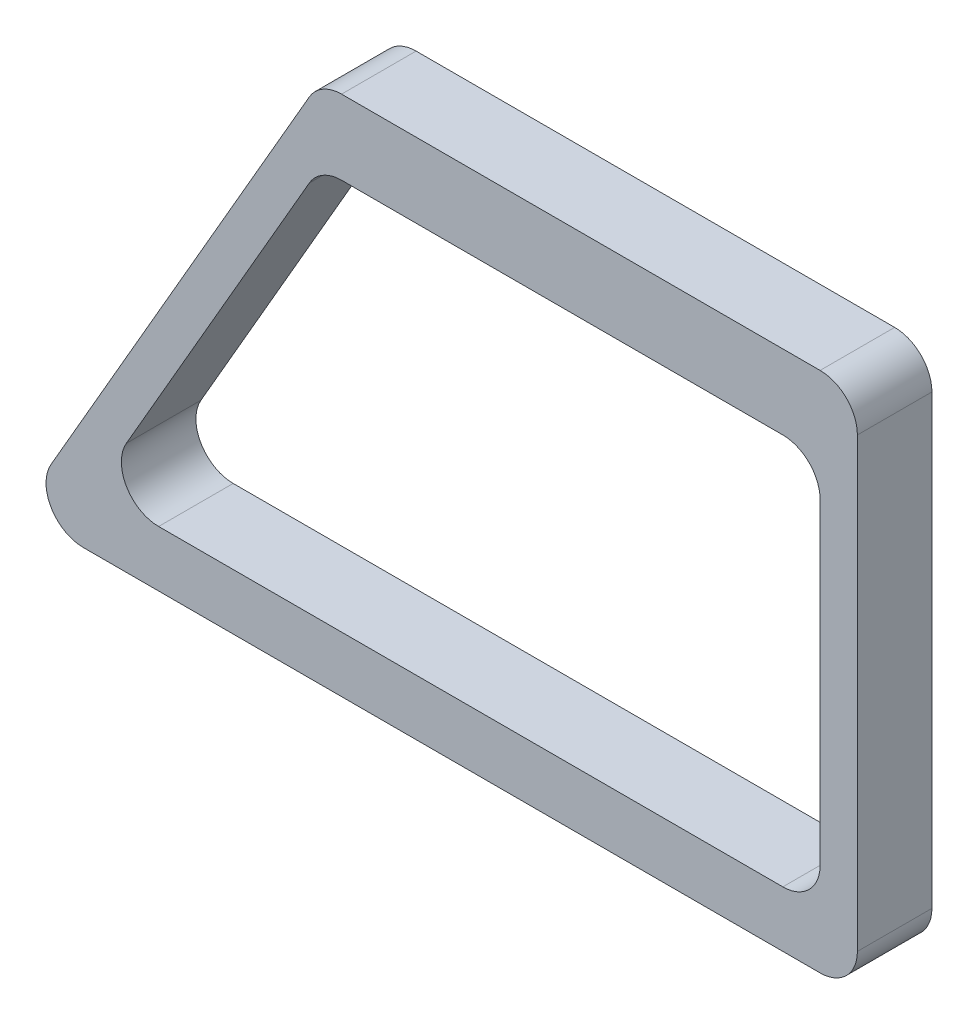
ISO-10303-21;
HEADER;
FILE_DESCRIPTION(('STEP AP214'),'2;1');
FILE_NAME('part.step','',(''),(''),'','','');
FILE_SCHEMA(('AUTOMOTIVE_DESIGN { 1 0 10303 214 1 1 1 1 }'));
ENDSEC;
DATA;
#1=APPLICATION_CONTEXT('core data for automotive mechanical design processes');
#2=APPLICATION_PROTOCOL_DEFINITION('international standard','automotive_design',2000,#1);
#3=PRODUCT_CONTEXT('',#1,'mechanical');
#4=PRODUCT('Part','Part','',(#3));
#5=PRODUCT_RELATED_PRODUCT_CATEGORY('part','',(#4));
#6=PRODUCT_DEFINITION_FORMATION('','',#4);
#7=PRODUCT_DEFINITION_CONTEXT('part definition',#1,'design');
#8=PRODUCT_DEFINITION('design','',#6,#7);
#9=PRODUCT_DEFINITION_SHAPE('','',#8);
#10=(LENGTH_UNIT() NAMED_UNIT(*) SI_UNIT(.MILLI.,.METRE.));
#11=(NAMED_UNIT(*) PLANE_ANGLE_UNIT() SI_UNIT($,.RADIAN.));
#12=(NAMED_UNIT(*) SI_UNIT($,.STERADIAN.) SOLID_ANGLE_UNIT());
#13=UNCERTAINTY_MEASURE_WITH_UNIT(LENGTH_MEASURE(1.E-05),#10,'distance_accuracy_value','');
#14=(GEOMETRIC_REPRESENTATION_CONTEXT(3) GLOBAL_UNCERTAINTY_ASSIGNED_CONTEXT((#13)) GLOBAL_UNIT_ASSIGNED_CONTEXT((#10,
#11,#12)) REPRESENTATION_CONTEXT('',''));
#15=CARTESIAN_POINT('',(0.,0.,0.));
#16=DIRECTION('',(0.,0.,1.));
#17=DIRECTION('',(1.,0.,0.));
#18=AXIS2_PLACEMENT_3D('',#15,#16,#17);
#19=CARTESIAN_POINT('',(393.350285010534,0.,40.));
#20=DIRECTION('',(-1.,0.,0.));
#21=DIRECTION('',(0.,0.,1.));
#22=AXIS2_PLACEMENT_3D('',#19,#20,#21);
#23=PLANE('',#22);
#24=DIRECTION('',(0.,1.,0.));
#25=VECTOR('',#24,1.);
#26=CARTESIAN_POINT('',(393.350285010534,0.,0.));
#27=LINE('',#26,#25);
#28=CARTESIAN_POINT('',(393.350285010534,3.6268533507812,0.));
#29=VERTEX_POINT('',#28);
#30=CARTESIAN_POINT('',(393.350285010534,173.626853350781,0.));
#31=VERTEX_POINT('',#30);
#32=EDGE_CURVE('E190',#29,#31,#27,.T.);
#33=ORIENTED_EDGE('',*,*,#32,.F.);
#34=DIRECTION('',(0.,0.,-1.));
#35=VECTOR('',#34,1.);
#36=CARTESIAN_POINT('',(393.350285010534,3.6268533507812,40.));
#37=LINE('',#36,#35);
#38=CARTESIAN_POINT('',(393.350285010534,3.6268533507812,40.));
#39=VERTEX_POINT('',#38);
#40=EDGE_CURVE('E165',#29,#39,#37,.F.);
#41=ORIENTED_EDGE('',*,*,#40,.T.);
#42=DIRECTION('',(0.,1.,0.));
#43=VECTOR('',#42,1.);
#44=CARTESIAN_POINT('',(393.350285010534,0.,40.));
#45=LINE('',#44,#43);
#46=CARTESIAN_POINT('',(393.350285010534,173.626853350781,40.));
#47=VERTEX_POINT('',#46);
#48=EDGE_CURVE('E363',#39,#47,#45,.T.);
#49=ORIENTED_EDGE('',*,*,#48,.T.);
#50=DIRECTION('',(0.,0.,-1.));
#51=VECTOR('',#50,1.);
#52=CARTESIAN_POINT('',(393.350285010534,173.626853350781,40.));
#53=LINE('',#52,#51);
#54=EDGE_CURVE('E182',#47,#31,#53,.T.);
#55=ORIENTED_EDGE('',*,*,#54,.T.);
#56=EDGE_LOOP('',(#33,#41,#49,#55));
#57=FACE_BOUND('',#56,.T.);
#58=ADVANCED_FACE('F45',(#57),#23,.T.);
#59=CARTESIAN_POINT('',(0.,-16.3731466492188,40.));
#60=DIRECTION('',(0.,-1.,0.));
#61=DIRECTION('',(1.,0.,0.));
#62=AXIS2_PLACEMENT_3D('',#59,#60,#61);
#63=PLANE('',#62);
#64=DIRECTION('',(-1.,0.,0.));
#65=VECTOR('',#64,1.);
#66=CARTESIAN_POINT('',(0.,-16.3731466492188,40.));
#67=LINE('',#66,#65);
#68=CARTESIAN_POINT('',(373.350285010534,-16.3731466492188,40.));
#69=VERTEX_POINT('',#68);
#70=CARTESIAN_POINT('',(38.405820005185,-16.3731466492188,40.));
#71=VERTEX_POINT('',#70);
#72=EDGE_CURVE('E180',#69,#71,#67,.T.);
#73=ORIENTED_EDGE('',*,*,#72,.F.);
#74=DIRECTION('',(0.,0.,-1.));
#75=VECTOR('',#74,1.);
#76=CARTESIAN_POINT('',(373.350285010534,-16.3731466492188,40.));
#77=LINE('',#76,#75);
#78=CARTESIAN_POINT('',(373.350285010534,-16.3731466492188,0.));
#79=VERTEX_POINT('',#78);
#80=EDGE_CURVE('E164',#69,#79,#77,.T.);
#81=ORIENTED_EDGE('',*,*,#80,.T.);
#82=DIRECTION('',(-1.,0.,0.));
#83=VECTOR('',#82,1.);
#84=CARTESIAN_POINT('',(0.,-16.3731466492188,0.));
#85=LINE('',#84,#83);
#86=CARTESIAN_POINT('',(38.405820005185,-16.3731466492188,0.));
#87=VERTEX_POINT('',#86);
#88=EDGE_CURVE('E177',#79,#87,#85,.T.);
#89=ORIENTED_EDGE('',*,*,#88,.T.);
#90=DIRECTION('',(0.,0.,-1.));
#91=VECTOR('',#90,1.);
#92=CARTESIAN_POINT('',(38.405820005185,-16.3731466492188,40.));
#93=LINE('',#92,#91);
#94=EDGE_CURVE('E183',#87,#71,#93,.F.);
#95=ORIENTED_EDGE('',*,*,#94,.T.);
#96=EDGE_LOOP('',(#73,#81,#89,#95));
#97=FACE_BOUND('',#96,.T.);
#98=ADVANCED_FACE('F176',(#97),#63,.F.);
#99=CARTESIAN_POINT('',(9.91338335941142,-5.72349455113614,40.));
#100=DIRECTION('',(-0.866025403784439,0.5,0.));
#101=DIRECTION('',(-0.5,-0.866025403784439,0.));
#102=AXIS2_PLACEMENT_3D('',#99,#100,#101);
#103=PLANE('',#102);
#104=DIRECTION('',(0.5,0.866025403784439,0.));
#105=VECTOR('',#104,1.);
#106=CARTESIAN_POINT('',(9.91338335941142,-5.72349455113614,40.));
#107=LINE('',#106,#105);
#108=CARTESIAN_POINT('',(21.0853119294963,13.6268533507812,40.));
#109=VERTEX_POINT('',#108);
#110=CARTESIAN_POINT('',(119.234857691733,183.626853350781,40.));
#111=VERTEX_POINT('',#110);
#112=EDGE_CURVE('E307',#109,#111,#107,.T.);
#113=ORIENTED_EDGE('',*,*,#112,.F.);
#114=DIRECTION('',(0.,0.,-1.));
#115=VECTOR('',#114,1.);
#116=CARTESIAN_POINT('',(21.0853119294963,13.6268533507812,0.));
#117=LINE('',#116,#115);
#118=CARTESIAN_POINT('',(21.0853119294963,13.6268533507812,0.));
#119=VERTEX_POINT('',#118);
#120=EDGE_CURVE('E216',#109,#119,#117,.T.);
#121=ORIENTED_EDGE('',*,*,#120,.T.);
#122=DIRECTION('',(0.5,0.866025403784439,0.));
#123=VECTOR('',#122,1.);
#124=CARTESIAN_POINT('',(9.91338335941142,-5.72349455113614,0.));
#125=LINE('',#124,#123);
#126=CARTESIAN_POINT('',(119.234857691733,183.626853350781,0.));
#127=VERTEX_POINT('',#126);
#128=EDGE_CURVE('E189',#119,#127,#125,.T.);
#129=ORIENTED_EDGE('',*,*,#128,.T.);
#130=DIRECTION('',(0.,0.,-1.));
#131=VECTOR('',#130,1.);
#132=CARTESIAN_POINT('',(119.234857691733,183.626853350781,40.));
#133=LINE('',#132,#131);
#134=EDGE_CURVE('E213',#127,#111,#133,.F.);
#135=ORIENTED_EDGE('',*,*,#134,.T.);
#136=EDGE_LOOP('',(#113,#121,#129,#135));
#137=FACE_BOUND('',#136,.T.);
#138=ADVANCED_FACE('F296',(#137),#103,.F.);
#139=CARTESIAN_POINT('',(0.,-46.3731466492188,40.));
#140=DIRECTION('',(0.,1.,0.));
#141=DIRECTION('',(-1.,0.,0.));
#142=AXIS2_PLACEMENT_3D('',#139,#140,#141);
#143=PLANE('',#142);
#144=DIRECTION('',(1.,0.,0.));
#145=VECTOR('',#144,1.);
#146=CARTESIAN_POINT('',(0.,-46.3731466492188,0.));
#147=LINE('',#146,#145);
#148=CARTESIAN_POINT('',(-2.00869883808871,-46.3731466492188,0.));
#149=VERTEX_POINT('',#148);
#150=CARTESIAN_POINT('',(393.350285010534,-46.3731466492188,0.));
#151=VERTEX_POINT('',#150);
#152=EDGE_CURVE('E317',#149,#151,#147,.T.);
#153=ORIENTED_EDGE('',*,*,#152,.T.);
#154=DIRECTION('',(0.,0.,-1.));
#155=VECTOR('',#154,1.);
#156=CARTESIAN_POINT('',(393.350285010534,-46.3731466492188,40.));
#157=LINE('',#156,#155);
#158=CARTESIAN_POINT('',(393.350285010534,-46.3731466492188,40.));
#159=VERTEX_POINT('',#158);
#160=EDGE_CURVE('E268',#151,#159,#157,.F.);
#161=ORIENTED_EDGE('',*,*,#160,.T.);
#162=DIRECTION('',(1.,0.,0.));
#163=VECTOR('',#162,1.);
#164=CARTESIAN_POINT('',(0.,-46.3731466492188,40.));
#165=LINE('',#164,#163);
#166=CARTESIAN_POINT('',(-2.00869883808871,-46.3731466492188,40.));
#167=VERTEX_POINT('',#166);
#168=EDGE_CURVE('E204',#167,#159,#165,.T.);
#169=ORIENTED_EDGE('',*,*,#168,.F.);
#170=DIRECTION('',(0.,0.,-1.));
#171=VECTOR('',#170,1.);
#172=CARTESIAN_POINT('',(-2.00869883808871,-46.3731466492188,0.));
#173=LINE('',#172,#171);
#174=EDGE_CURVE('E264',#167,#149,#173,.T.);
#175=ORIENTED_EDGE('',*,*,#174,.T.);
#176=EDGE_LOOP('',(#153,#161,#169,#175));
#177=FACE_BOUND('',#176,.T.);
#178=ADVANCED_FACE('F346',(#177),#143,.F.);
#179=CARTESIAN_POINT('',(413.350285010534,1.63896787019309E-13,40.));
#180=DIRECTION('',(-1.,0.,0.));
#181=DIRECTION('',(0.,-1.,0.));
#182=AXIS2_PLACEMENT_3D('',#179,#180,#181);
#183=PLANE('',#182);
#184=DIRECTION('',(0.,1.,0.));
#185=VECTOR('',#184,1.);
#186=CARTESIAN_POINT('',(413.350285010534,1.63896787019309E-13,0.));
#187=LINE('',#186,#185);
#188=CARTESIAN_POINT('',(413.350285010534,-26.3731466492188,0.));
#189=VERTEX_POINT('',#188);
#190=CARTESIAN_POINT('',(413.350285010534,213.626853350781,0.));
#191=VERTEX_POINT('',#190);
#192=EDGE_CURVE('E321',#189,#191,#187,.T.);
#193=ORIENTED_EDGE('',*,*,#192,.T.);
#194=DIRECTION('',(0.,0.,-1.));
#195=VECTOR('',#194,1.);
#196=CARTESIAN_POINT('',(413.350285010534,213.626853350781,40.));
#197=LINE('',#196,#195);
#198=CARTESIAN_POINT('',(413.350285010534,213.626853350781,40.));
#199=VERTEX_POINT('',#198);
#200=EDGE_CURVE('E250',#191,#199,#197,.F.);
#201=ORIENTED_EDGE('',*,*,#200,.T.);
#202=DIRECTION('',(0.,1.,0.));
#203=VECTOR('',#202,1.);
#204=CARTESIAN_POINT('',(413.350285010534,1.63896787019309E-13,40.));
#205=LINE('',#204,#203);
#206=CARTESIAN_POINT('',(413.350285010534,-26.3731466492188,40.));
#207=VERTEX_POINT('',#206);
#208=EDGE_CURVE('E349',#207,#199,#205,.T.);
#209=ORIENTED_EDGE('',*,*,#208,.F.);
#210=DIRECTION('',(0.,0.,-1.));
#211=VECTOR('',#210,1.);
#212=CARTESIAN_POINT('',(413.350285010534,-26.3731466492188,40.));
#213=LINE('',#212,#211);
#214=EDGE_CURVE('E246',#207,#189,#213,.T.);
#215=ORIENTED_EDGE('',*,*,#214,.T.);
#216=EDGE_LOOP('',(#193,#201,#209,#215));
#217=FACE_BOUND('',#216,.T.);
#218=ADVANCED_FACE('F395',(#217),#183,.F.);
#219=CARTESIAN_POINT('',(0.,233.626853350781,40.));
#220=DIRECTION('',(0.,1.,0.));
#221=DIRECTION('',(-1.,0.,0.));
#222=AXIS2_PLACEMENT_3D('',#219,#220,#221);
#223=PLANE('',#222);
#224=DIRECTION('',(1.,0.,0.));
#225=VECTOR('',#224,1.);
#226=CARTESIAN_POINT('',(0.,233.626853350781,40.));
#227=LINE('',#226,#225);
#228=CARTESIAN_POINT('',(136.555365767421,233.626853350781,40.));
#229=VERTEX_POINT('',#228);
#230=CARTESIAN_POINT('',(393.350285010534,233.626853350781,40.));
#231=VERTEX_POINT('',#230);
#232=EDGE_CURVE('E352',#229,#231,#227,.T.);
#233=ORIENTED_EDGE('',*,*,#232,.T.);
#234=DIRECTION('',(0.,0.,-1.));
#235=VECTOR('',#234,1.);
#236=CARTESIAN_POINT('',(393.350285010534,233.626853350781,0.));
#237=LINE('',#236,#235);
#238=CARTESIAN_POINT('',(393.350285010534,233.626853350781,0.));
#239=VERTEX_POINT('',#238);
#240=EDGE_CURVE('E230',#231,#239,#237,.T.);
#241=ORIENTED_EDGE('',*,*,#240,.T.);
#242=DIRECTION('',(1.,0.,0.));
#243=VECTOR('',#242,1.);
#244=CARTESIAN_POINT('',(0.,233.626853350781,0.));
#245=LINE('',#244,#243);
#246=CARTESIAN_POINT('',(136.555365767421,233.626853350781,0.));
#247=VERTEX_POINT('',#246);
#248=EDGE_CURVE('E326',#247,#239,#245,.T.);
#249=ORIENTED_EDGE('',*,*,#248,.F.);
#250=DIRECTION('',(0.,0.,-1.));
#251=VECTOR('',#250,1.);
#252=CARTESIAN_POINT('',(136.555365767421,233.626853350781,40.));
#253=LINE('',#252,#251);
#254=EDGE_CURVE('E227',#247,#229,#253,.F.);
#255=ORIENTED_EDGE('',*,*,#254,.T.);
#256=EDGE_LOOP('',(#233,#241,#249,#255));
#257=FACE_BOUND('',#256,.T.);
#258=ADVANCED_FACE('F392',(#257),#223,.T.);
#259=CARTESIAN_POINT('',(-7.40712471627735,4.27650544886386,40.));
#260=DIRECTION('',(-0.866025403784439,0.5,0.));
#261=DIRECTION('',(-0.5,-0.866025403784439,0.));
#262=AXIS2_PLACEMENT_3D('',#259,#260,#261);
#263=PLANE('',#262);
#264=DIRECTION('',(0.5,0.866025403784439,0.));
#265=VECTOR('',#264,1.);
#266=CARTESIAN_POINT('',(-7.40712471627735,4.27650544886386,0.));
#267=LINE('',#266,#265);
#268=CARTESIAN_POINT('',(-19.3292069137775,-16.3731466492188,0.));
#269=VERTEX_POINT('',#268);
#270=CARTESIAN_POINT('',(119.234857691733,223.626853350781,0.));
#271=VERTEX_POINT('',#270);
#272=EDGE_CURVE('E197',#269,#271,#267,.T.);
#273=ORIENTED_EDGE('',*,*,#272,.F.);
#274=DIRECTION('',(0.,0.,-1.));
#275=VECTOR('',#274,1.);
#276=CARTESIAN_POINT('',(-19.3292069137775,-16.3731466492188,40.));
#277=LINE('',#276,#275);
#278=CARTESIAN_POINT('',(-19.3292069137775,-16.3731466492188,40.));
#279=VERTEX_POINT('',#278);
#280=EDGE_CURVE('E68',#269,#279,#277,.F.);
#281=ORIENTED_EDGE('',*,*,#280,.T.);
#282=DIRECTION('',(0.5,0.866025403784439,0.));
#283=VECTOR('',#282,1.);
#284=CARTESIAN_POINT('',(-7.40712471627735,4.27650544886386,40.));
#285=LINE('',#284,#283);
#286=CARTESIAN_POINT('',(119.234857691733,223.626853350781,40.));
#287=VERTEX_POINT('',#286);
#288=EDGE_CURVE('E344',#279,#287,#285,.T.);
#289=ORIENTED_EDGE('',*,*,#288,.T.);
#290=DIRECTION('',(0.,0.,-1.));
#291=VECTOR('',#290,1.);
#292=CARTESIAN_POINT('',(119.234857691733,223.626853350781,40.));
#293=LINE('',#292,#291);
#294=EDGE_CURVE('E271',#287,#271,#293,.T.);
#295=ORIENTED_EDGE('',*,*,#294,.T.);
#296=EDGE_LOOP('',(#273,#281,#289,#295));
#297=FACE_BOUND('',#296,.T.);
#298=ADVANCED_FACE('F334',(#297),#263,.T.);
#299=CARTESIAN_POINT('',(0.,193.626853350781,40.));
#300=DIRECTION('',(0.,1.,0.));
#301=DIRECTION('',(0.,0.,1.));
#302=AXIS2_PLACEMENT_3D('',#299,#300,#301);
#303=PLANE('',#302);
#304=DIRECTION('',(1.,0.,0.));
#305=VECTOR('',#304,1.);
#306=CARTESIAN_POINT('',(0.,193.626853350781,0.));
#307=LINE('',#306,#305);
#308=CARTESIAN_POINT('',(136.555365767421,193.626853350781,0.));
#309=VERTEX_POINT('',#308);
#310=CARTESIAN_POINT('',(373.350285010534,193.626853350781,0.));
#311=VERTEX_POINT('',#310);
#312=EDGE_CURVE('E195',#309,#311,#307,.T.);
#313=ORIENTED_EDGE('',*,*,#312,.T.);
#314=DIRECTION('',(0.,0.,-1.));
#315=VECTOR('',#314,1.);
#316=CARTESIAN_POINT('',(373.350285010534,193.626853350781,40.));
#317=LINE('',#316,#315);
#318=CARTESIAN_POINT('',(373.350285010534,193.626853350781,40.));
#319=VERTEX_POINT('',#318);
#320=EDGE_CURVE('E224',#311,#319,#317,.F.);
#321=ORIENTED_EDGE('',*,*,#320,.T.);
#322=DIRECTION('',(1.,0.,0.));
#323=VECTOR('',#322,1.);
#324=CARTESIAN_POINT('',(0.,193.626853350781,40.));
#325=LINE('',#324,#323);
#326=CARTESIAN_POINT('',(136.555365767421,193.626853350781,40.));
#327=VERTEX_POINT('',#326);
#328=EDGE_CURVE('E206',#327,#319,#325,.T.);
#329=ORIENTED_EDGE('',*,*,#328,.F.);
#330=DIRECTION('',(0.,0.,-1.));
#331=VECTOR('',#330,1.);
#332=CARTESIAN_POINT('',(136.555365767421,193.626853350781,0.));
#333=LINE('',#332,#331);
#334=EDGE_CURVE('E220',#327,#309,#333,.T.);
#335=ORIENTED_EDGE('',*,*,#334,.T.);
#336=EDGE_LOOP('',(#313,#321,#329,#335));
#337=FACE_BOUND('',#336,.T.);
#338=ADVANCED_FACE('F309',(#337),#303,.F.);
#339=CARTESIAN_POINT('',(0.,0.,40.));
#340=DIRECTION('',(0.,0.,1.));
#341=DIRECTION('',(1.,0.,0.));
#342=AXIS2_PLACEMENT_3D('',#339,#340,#341);
#343=PLANE('',#342);
#344=ORIENTED_EDGE('',*,*,#208,.T.);
#345=CARTESIAN_POINT('',(393.350285010534,213.626853350781,40.));
#346=DIRECTION('',(0.,0.,1.));
#347=DIRECTION('',(1.,0.,0.));
#348=AXIS2_PLACEMENT_3D('',#345,#346,#347);
#349=CIRCLE('',#348,20.);
#350=EDGE_CURVE('E261',#199,#231,#349,.T.);
#351=ORIENTED_EDGE('',*,*,#350,.T.);
#352=ORIENTED_EDGE('',*,*,#232,.F.);
#353=CARTESIAN_POINT('',(136.555365767421,213.626853350781,40.));
#354=DIRECTION('',(0.,0.,1.));
#355=DIRECTION('',(1.,0.,0.));
#356=AXIS2_PLACEMENT_3D('',#353,#354,#355);
#357=CIRCLE('',#356,20.);
#358=EDGE_CURVE('E61',#229,#287,#357,.T.);
#359=ORIENTED_EDGE('',*,*,#358,.T.);
#360=ORIENTED_EDGE('',*,*,#288,.F.);
#361=CARTESIAN_POINT('',(-2.00869883808871,-26.3731466492188,40.));
#362=DIRECTION('',(0.,0.,1.));
#363=DIRECTION('',(1.,0.,0.));
#364=AXIS2_PLACEMENT_3D('',#361,#362,#363);
#365=CIRCLE('',#364,20.);
#366=EDGE_CURVE('E255',#279,#167,#365,.T.);
#367=ORIENTED_EDGE('',*,*,#366,.T.);
#368=ORIENTED_EDGE('',*,*,#168,.T.);
#369=CARTESIAN_POINT('',(393.350285010534,-26.3731466492188,40.));
#370=DIRECTION('',(0.,0.,1.));
#371=DIRECTION('',(1.,0.,0.));
#372=AXIS2_PLACEMENT_3D('',#369,#370,#371);
#373=CIRCLE('',#372,20.);
#374=EDGE_CURVE('E258',#159,#207,#373,.T.);
#375=ORIENTED_EDGE('',*,*,#374,.T.);
#376=EDGE_LOOP('',(#344,#351,#352,#359,#360,#367,#368,#375));
#377=FACE_BOUND('',#376,.T.);
#378=ORIENTED_EDGE('',*,*,#48,.F.);
#379=CARTESIAN_POINT('',(373.350285010534,3.6268533507812,40.));
#380=DIRECTION('',(0.,0.,1.));
#381=DIRECTION('',(1.,0.,0.));
#382=AXIS2_PLACEMENT_3D('',#379,#380,#381);
#383=CIRCLE('',#382,20.);
#384=EDGE_CURVE('E171',#39,#69,#383,.F.);
#385=ORIENTED_EDGE('',*,*,#384,.T.);
#386=ORIENTED_EDGE('',*,*,#72,.T.);
#387=CARTESIAN_POINT('',(38.405820005185,3.62685335078116,40.));
#388=DIRECTION('',(0.,0.,1.));
#389=DIRECTION('',(1.,0.,0.));
#390=AXIS2_PLACEMENT_3D('',#387,#388,#389);
#391=CIRCLE('',#390,20.);
#392=EDGE_CURVE('E281',#71,#109,#391,.F.);
#393=ORIENTED_EDGE('',*,*,#392,.T.);
#394=ORIENTED_EDGE('',*,*,#112,.T.);
#395=CARTESIAN_POINT('',(136.555365767421,173.626853350781,40.));
#396=DIRECTION('',(0.,0.,1.));
#397=DIRECTION('',(1.,0.,0.));
#398=AXIS2_PLACEMENT_3D('',#395,#396,#397);
#399=CIRCLE('',#398,20.);
#400=EDGE_CURVE('E11',#111,#327,#399,.F.);
#401=ORIENTED_EDGE('',*,*,#400,.T.);
#402=ORIENTED_EDGE('',*,*,#328,.T.);
#403=CARTESIAN_POINT('',(373.350285010534,173.626853350781,40.));
#404=DIRECTION('',(0.,0.,1.));
#405=DIRECTION('',(1.,0.,0.));
#406=AXIS2_PLACEMENT_3D('',#403,#404,#405);
#407=CIRCLE('',#406,20.);
#408=EDGE_CURVE('E287',#319,#47,#407,.F.);
#409=ORIENTED_EDGE('',*,*,#408,.T.);
#410=EDGE_LOOP('',(#378,#385,#386,#393,#394,#401,#402,#409));
#411=FACE_BOUND('',#410,.T.);
#412=ADVANCED_FACE('F305',(#377,#411),#343,.T.);
#413=CARTESIAN_POINT('',(0.,0.,0.));
#414=DIRECTION('',(0.,0.,1.));
#415=DIRECTION('',(1.,0.,0.));
#416=AXIS2_PLACEMENT_3D('',#413,#414,#415);
#417=PLANE('',#416);
#418=CARTESIAN_POINT('',(328.987041513819,211.126853350781,0.));
#419=DIRECTION('',(0.,0.,1.));
#420=DIRECTION('',(1.,0.,0.));
#421=AXIS2_PLACEMENT_3D('',#418,#419,#420);
#422=CIRCLE('',#421,2.50000000000002);
#423=CARTESIAN_POINT('',(331.487041513819,211.126853350781,0.));
#424=VERTEX_POINT('',#423);
#425=EDGE_CURVE('E466',#424,#424,#422,.T.);
#426=ORIENTED_EDGE('',*,*,#425,.T.);
#427=EDGE_LOOP('',(#426));
#428=FACE_BOUND('',#427,.T.);
#429=CARTESIAN_POINT('',(348.987041513819,226.126853350781,0.));
#430=DIRECTION('',(0.,0.,1.));
#431=DIRECTION('',(1.,0.,0.));
#432=AXIS2_PLACEMENT_3D('',#429,#430,#431);
#433=CIRCLE('',#432,2.5);
#434=CARTESIAN_POINT('',(351.487041513819,226.126853350781,0.));
#435=VERTEX_POINT('',#434);
#436=EDGE_CURVE('E479',#435,#435,#433,.T.);
#437=ORIENTED_EDGE('',*,*,#436,.T.);
#438=EDGE_LOOP('',(#437));
#439=FACE_BOUND('',#438,.T.);
#440=CARTESIAN_POINT('',(308.987041513819,226.126853350781,0.));
#441=DIRECTION('',(0.,0.,1.));
#442=DIRECTION('',(1.,0.,0.));
#443=AXIS2_PLACEMENT_3D('',#440,#441,#442);
#444=CIRCLE('',#443,2.50000000000002);
#445=CARTESIAN_POINT('',(311.487041513819,226.126853350781,0.));
#446=VERTEX_POINT('',#445);
#447=EDGE_CURVE('E487',#446,#446,#444,.T.);
#448=ORIENTED_EDGE('',*,*,#447,.T.);
#449=EDGE_LOOP('',(#448));
#450=FACE_BOUND('',#449,.T.);
#451=CARTESIAN_POINT('',(200.923528507248,211.126853350781,0.));
#452=DIRECTION('',(0.,0.,-1.));
#453=DIRECTION('',(-1.,0.,0.));
#454=AXIS2_PLACEMENT_3D('',#451,#452,#453);
#455=CIRCLE('',#454,2.50000000000002);
#456=CARTESIAN_POINT('',(198.423528507248,211.126853350781,0.));
#457=VERTEX_POINT('',#456);
#458=EDGE_CURVE('E494',#457,#457,#455,.T.);
#459=ORIENTED_EDGE('',*,*,#458,.F.);
#460=EDGE_LOOP('',(#459));
#461=FACE_BOUND('',#460,.T.);
#462=CARTESIAN_POINT('',(180.923528507249,226.126853350781,0.));
#463=DIRECTION('',(0.,0.,-1.));
#464=DIRECTION('',(-1.,0.,0.));
#465=AXIS2_PLACEMENT_3D('',#462,#463,#464);
#466=CIRCLE('',#465,2.5);
#467=CARTESIAN_POINT('',(178.423528507249,226.126853350781,0.));
#468=VERTEX_POINT('',#467);
#469=EDGE_CURVE('E498',#468,#468,#466,.T.);
#470=ORIENTED_EDGE('',*,*,#469,.F.);
#471=EDGE_LOOP('',(#470));
#472=FACE_BOUND('',#471,.T.);
#473=CARTESIAN_POINT('',(220.923528507249,226.126853350781,0.));
#474=DIRECTION('',(0.,0.,-1.));
#475=DIRECTION('',(-1.,0.,0.));
#476=AXIS2_PLACEMENT_3D('',#473,#474,#475);
#477=CIRCLE('',#476,2.50000000000002);
#478=CARTESIAN_POINT('',(218.423528507249,226.126853350781,0.));
#479=VERTEX_POINT('',#478);
#480=EDGE_CURVE('E471',#479,#479,#477,.T.);
#481=ORIENTED_EDGE('',*,*,#480,.F.);
#482=EDGE_LOOP('',(#481));
#483=FACE_BOUND('',#482,.T.);
#484=ORIENTED_EDGE('',*,*,#248,.T.);
#485=CARTESIAN_POINT('',(393.350285010534,213.626853350781,0.));
#486=DIRECTION('',(0.,0.,1.));
#487=DIRECTION('',(1.,0.,0.));
#488=AXIS2_PLACEMENT_3D('',#485,#486,#487);
#489=CIRCLE('',#488,20.);
#490=EDGE_CURVE('E243',#239,#191,#489,.F.);
#491=ORIENTED_EDGE('',*,*,#490,.T.);
#492=ORIENTED_EDGE('',*,*,#192,.F.);
#493=CARTESIAN_POINT('',(393.350285010534,-26.3731466492188,0.));
#494=DIRECTION('',(0.,0.,1.));
#495=DIRECTION('',(1.,0.,0.));
#496=AXIS2_PLACEMENT_3D('',#493,#494,#495);
#497=CIRCLE('',#496,20.);
#498=EDGE_CURVE('E240',#189,#151,#497,.F.);
#499=ORIENTED_EDGE('',*,*,#498,.T.);
#500=ORIENTED_EDGE('',*,*,#152,.F.);
#501=CARTESIAN_POINT('',(-2.00869883808871,-26.3731466492188,0.));
#502=DIRECTION('',(0.,0.,1.));
#503=DIRECTION('',(1.,0.,0.));
#504=AXIS2_PLACEMENT_3D('',#501,#502,#503);
#505=CIRCLE('',#504,20.);
#506=EDGE_CURVE('E237',#149,#269,#505,.F.);
#507=ORIENTED_EDGE('',*,*,#506,.T.);
#508=ORIENTED_EDGE('',*,*,#272,.T.);
#509=CARTESIAN_POINT('',(136.555365767421,213.626853350781,0.));
#510=DIRECTION('',(0.,0.,1.));
#511=DIRECTION('',(1.,0.,0.));
#512=AXIS2_PLACEMENT_3D('',#509,#510,#511);
#513=CIRCLE('',#512,20.);
#514=EDGE_CURVE('E234',#271,#247,#513,.F.);
#515=ORIENTED_EDGE('',*,*,#514,.T.);
#516=EDGE_LOOP('',(#484,#491,#492,#499,#500,#507,#508,#515));
#517=FACE_BOUND('',#516,.T.);
#518=ORIENTED_EDGE('',*,*,#88,.F.);
#519=CARTESIAN_POINT('',(373.350285010534,3.6268533507812,0.));
#520=DIRECTION('',(0.,0.,1.));
#521=DIRECTION('',(1.,0.,0.));
#522=AXIS2_PLACEMENT_3D('',#519,#520,#521);
#523=CIRCLE('',#522,20.);
#524=EDGE_CURVE('E160',#79,#29,#523,.T.);
#525=ORIENTED_EDGE('',*,*,#524,.T.);
#526=ORIENTED_EDGE('',*,*,#32,.T.);
#527=CARTESIAN_POINT('',(373.350285010534,173.626853350781,0.));
#528=DIRECTION('',(0.,0.,1.));
#529=DIRECTION('',(1.,0.,0.));
#530=AXIS2_PLACEMENT_3D('',#527,#528,#529);
#531=CIRCLE('',#530,20.);
#532=EDGE_CURVE('E284',#31,#311,#531,.T.);
#533=ORIENTED_EDGE('',*,*,#532,.T.);
#534=ORIENTED_EDGE('',*,*,#312,.F.);
#535=CARTESIAN_POINT('',(136.555365767421,173.626853350781,0.));
#536=DIRECTION('',(0.,0.,1.));
#537=DIRECTION('',(1.,0.,0.));
#538=AXIS2_PLACEMENT_3D('',#535,#536,#537);
#539=CIRCLE('',#538,20.);
#540=EDGE_CURVE('E54',#309,#127,#539,.T.);
#541=ORIENTED_EDGE('',*,*,#540,.T.);
#542=ORIENTED_EDGE('',*,*,#128,.F.);
#543=CARTESIAN_POINT('',(38.405820005185,3.62685335078116,0.));
#544=DIRECTION('',(0.,0.,1.));
#545=DIRECTION('',(1.,0.,0.));
#546=AXIS2_PLACEMENT_3D('',#543,#544,#545);
#547=CIRCLE('',#546,20.);
#548=EDGE_CURVE('E187',#119,#87,#547,.T.);
#549=ORIENTED_EDGE('',*,*,#548,.T.);
#550=EDGE_LOOP('',(#518,#525,#526,#533,#534,#541,#542,#549));
#551=FACE_BOUND('',#550,.T.);
#552=ADVANCED_FACE('F185',(#428,#439,#450,#461,#472,#483,#517,#551),#417,.F.);
#553=CARTESIAN_POINT('',(220.923528507249,226.126853350781,10.));
#554=DIRECTION('',(0.,0.,-1.));
#555=DIRECTION('',(-1.,0.,0.));
#556=AXIS2_PLACEMENT_3D('',#553,#554,#555);
#557=CYLINDRICAL_SURFACE('',#556,2.50000000000002);
#558=CARTESIAN_POINT('',(220.923528507249,226.126853350781,10.));
#559=DIRECTION('',(0.,0.,-1.));
#560=DIRECTION('',(-1.,0.,0.));
#561=AXIS2_PLACEMENT_3D('',#558,#559,#560);
#562=CIRCLE('',#561,2.50000000000002);
#563=CARTESIAN_POINT('',(218.423528507249,226.126853350781,10.));
#564=VERTEX_POINT('',#563);
#565=EDGE_CURVE('E355',#564,#564,#562,.T.);
#566=ORIENTED_EDGE('',*,*,#565,.F.);
#567=EDGE_LOOP('',(#566));
#568=FACE_BOUND('',#567,.T.);
#569=ORIENTED_EDGE('',*,*,#480,.T.);
#570=EDGE_LOOP('',(#569));
#571=FACE_BOUND('',#570,.T.);
#572=ADVANCED_FACE('F411',(#568,#571),#557,.F.);
#573=CARTESIAN_POINT('',(220.923528507249,226.126853350781,10.));
#574=DIRECTION('',(0.,0.,-1.));
#575=DIRECTION('',(-1.,0.,0.));
#576=AXIS2_PLACEMENT_3D('',#573,#574,#575);
#577=PLANE('',#576);
#578=ORIENTED_EDGE('',*,*,#565,.T.);
#579=EDGE_LOOP('',(#578));
#580=FACE_BOUND('',#579,.T.);
#581=ADVANCED_FACE('F415',(#580),#577,.T.);
#582=CARTESIAN_POINT('',(180.923528507249,226.126853350781,10.));
#583=DIRECTION('',(0.,0.,-1.));
#584=DIRECTION('',(-1.,0.,0.));
#585=AXIS2_PLACEMENT_3D('',#582,#583,#584);
#586=CYLINDRICAL_SURFACE('',#585,2.5);
#587=CARTESIAN_POINT('',(180.923528507249,226.126853350781,10.));
#588=DIRECTION('',(0.,0.,-1.));
#589=DIRECTION('',(-1.,0.,0.));
#590=AXIS2_PLACEMENT_3D('',#587,#588,#589);
#591=CIRCLE('',#590,2.5);
#592=CARTESIAN_POINT('',(178.423528507249,226.126853350781,10.));
#593=VERTEX_POINT('',#592);
#594=EDGE_CURVE('E502',#593,#593,#591,.T.);
#595=ORIENTED_EDGE('',*,*,#594,.F.);
#596=EDGE_LOOP('',(#595));
#597=FACE_BOUND('',#596,.T.);
#598=ORIENTED_EDGE('',*,*,#469,.T.);
#599=EDGE_LOOP('',(#598));
#600=FACE_BOUND('',#599,.T.);
#601=ADVANCED_FACE('F418',(#597,#600),#586,.F.);
#602=CARTESIAN_POINT('',(180.923528507249,226.126853350781,10.));
#603=DIRECTION('',(0.,0.,-1.));
#604=DIRECTION('',(-1.,0.,0.));
#605=AXIS2_PLACEMENT_3D('',#602,#603,#604);
#606=PLANE('',#605);
#607=ORIENTED_EDGE('',*,*,#594,.T.);
#608=EDGE_LOOP('',(#607));
#609=FACE_BOUND('',#608,.T.);
#610=ADVANCED_FACE('F423',(#609),#606,.T.);
#611=CARTESIAN_POINT('',(200.923528507248,211.126853350781,10.));
#612=DIRECTION('',(0.,0.,-1.));
#613=DIRECTION('',(-1.,0.,0.));
#614=AXIS2_PLACEMENT_3D('',#611,#612,#613);
#615=CYLINDRICAL_SURFACE('',#614,2.50000000000002);
#616=CARTESIAN_POINT('',(200.923528507248,211.126853350781,10.));
#617=DIRECTION('',(0.,0.,-1.));
#618=DIRECTION('',(-1.,0.,0.));
#619=AXIS2_PLACEMENT_3D('',#616,#617,#618);
#620=CIRCLE('',#619,2.50000000000002);
#621=CARTESIAN_POINT('',(198.423528507248,211.126853350781,10.));
#622=VERTEX_POINT('',#621);
#623=EDGE_CURVE('E322',#622,#622,#620,.T.);
#624=ORIENTED_EDGE('',*,*,#623,.F.);
#625=EDGE_LOOP('',(#624));
#626=FACE_BOUND('',#625,.T.);
#627=ORIENTED_EDGE('',*,*,#458,.T.);
#628=EDGE_LOOP('',(#627));
#629=FACE_BOUND('',#628,.T.);
#630=ADVANCED_FACE('F426',(#626,#629),#615,.F.);
#631=CARTESIAN_POINT('',(200.923528507248,211.126853350781,10.));
#632=DIRECTION('',(0.,0.,-1.));
#633=DIRECTION('',(-1.,0.,0.));
#634=AXIS2_PLACEMENT_3D('',#631,#632,#633);
#635=PLANE('',#634);
#636=ORIENTED_EDGE('',*,*,#623,.T.);
#637=EDGE_LOOP('',(#636));
#638=FACE_BOUND('',#637,.T.);
#639=ADVANCED_FACE('F433',(#638),#635,.T.);
#640=CARTESIAN_POINT('',(308.987041513819,226.126853350781,10.));
#641=DIRECTION('',(0.,0.,-1.));
#642=DIRECTION('',(-1.,0.,0.));
#643=AXIS2_PLACEMENT_3D('',#640,#641,#642);
#644=CYLINDRICAL_SURFACE('',#643,2.50000000000002);
#645=CARTESIAN_POINT('',(308.987041513819,226.126853350781,10.));
#646=DIRECTION('',(0.,0.,1.));
#647=DIRECTION('',(1.,0.,0.));
#648=AXIS2_PLACEMENT_3D('',#645,#646,#647);
#649=CIRCLE('',#648,2.50000000000002);
#650=CARTESIAN_POINT('',(311.487041513819,226.126853350781,10.));
#651=VERTEX_POINT('',#650);
#652=EDGE_CURVE('E483',#651,#651,#649,.T.);
#653=ORIENTED_EDGE('',*,*,#652,.T.);
#654=EDGE_LOOP('',(#653));
#655=FACE_BOUND('',#654,.T.);
#656=ORIENTED_EDGE('',*,*,#447,.F.);
#657=EDGE_LOOP('',(#656));
#658=FACE_BOUND('',#657,.T.);
#659=ADVANCED_FACE('F437',(#655,#658),#644,.F.);
#660=CARTESIAN_POINT('',(308.987041513819,226.126853350781,10.));
#661=DIRECTION('',(0.,0.,-1.));
#662=DIRECTION('',(1.,0.,0.));
#663=AXIS2_PLACEMENT_3D('',#660,#661,#662);
#664=PLANE('',#663);
#665=ORIENTED_EDGE('',*,*,#652,.F.);
#666=EDGE_LOOP('',(#665));
#667=FACE_BOUND('',#666,.T.);
#668=ADVANCED_FACE('F441',(#667),#664,.T.);
#669=CARTESIAN_POINT('',(348.987041513819,226.126853350781,10.));
#670=DIRECTION('',(0.,0.,-1.));
#671=DIRECTION('',(-1.,0.,0.));
#672=AXIS2_PLACEMENT_3D('',#669,#670,#671);
#673=CYLINDRICAL_SURFACE('',#672,2.5);
#674=CARTESIAN_POINT('',(348.987041513819,226.126853350781,10.));
#675=DIRECTION('',(0.,0.,1.));
#676=DIRECTION('',(1.,0.,0.));
#677=AXIS2_PLACEMENT_3D('',#674,#675,#676);
#678=CIRCLE('',#677,2.5);
#679=CARTESIAN_POINT('',(351.487041513819,226.126853350781,10.));
#680=VERTEX_POINT('',#679);
#681=EDGE_CURVE('E473',#680,#680,#678,.T.);
#682=ORIENTED_EDGE('',*,*,#681,.T.);
#683=EDGE_LOOP('',(#682));
#684=FACE_BOUND('',#683,.T.);
#685=ORIENTED_EDGE('',*,*,#436,.F.);
#686=EDGE_LOOP('',(#685));
#687=FACE_BOUND('',#686,.T.);
#688=ADVANCED_FACE('F445',(#684,#687),#673,.F.);
#689=CARTESIAN_POINT('',(348.987041513819,226.126853350781,10.));
#690=DIRECTION('',(0.,0.,-1.));
#691=DIRECTION('',(1.,0.,0.));
#692=AXIS2_PLACEMENT_3D('',#689,#690,#691);
#693=PLANE('',#692);
#694=ORIENTED_EDGE('',*,*,#681,.F.);
#695=EDGE_LOOP('',(#694));
#696=FACE_BOUND('',#695,.T.);
#697=ADVANCED_FACE('F449',(#696),#693,.T.);
#698=CARTESIAN_POINT('',(328.987041513819,211.126853350781,10.));
#699=DIRECTION('',(0.,0.,-1.));
#700=DIRECTION('',(-1.,0.,0.));
#701=AXIS2_PLACEMENT_3D('',#698,#699,#700);
#702=CYLINDRICAL_SURFACE('',#701,2.50000000000002);
#703=CARTESIAN_POINT('',(328.987041513819,211.126853350781,10.));
#704=DIRECTION('',(0.,0.,1.));
#705=DIRECTION('',(1.,0.,0.));
#706=AXIS2_PLACEMENT_3D('',#703,#704,#705);
#707=CIRCLE('',#706,2.50000000000002);
#708=CARTESIAN_POINT('',(331.487041513819,211.126853350781,10.));
#709=VERTEX_POINT('',#708);
#710=EDGE_CURVE('E464',#709,#709,#707,.T.);
#711=ORIENTED_EDGE('',*,*,#710,.T.);
#712=EDGE_LOOP('',(#711));
#713=FACE_BOUND('',#712,.T.);
#714=ORIENTED_EDGE('',*,*,#425,.F.);
#715=EDGE_LOOP('',(#714));
#716=FACE_BOUND('',#715,.T.);
#717=ADVANCED_FACE('F453',(#713,#716),#702,.F.);
#718=CARTESIAN_POINT('',(328.987041513819,211.126853350781,10.));
#719=DIRECTION('',(0.,0.,-1.));
#720=DIRECTION('',(1.,0.,0.));
#721=AXIS2_PLACEMENT_3D('',#718,#719,#720);
#722=PLANE('',#721);
#723=ORIENTED_EDGE('',*,*,#710,.F.);
#724=EDGE_LOOP('',(#723));
#725=FACE_BOUND('',#724,.T.);
#726=ADVANCED_FACE('F379',(#725),#722,.T.);
#727=CARTESIAN_POINT('',(373.350285010534,3.6268533507812,40.));
#728=DIRECTION('',(0.,0.,-1.));
#729=DIRECTION('',(-1.,0.,0.));
#730=AXIS2_PLACEMENT_3D('',#727,#728,#729);
#731=CYLINDRICAL_SURFACE('',#730,20.);
#732=ORIENTED_EDGE('',*,*,#384,.F.);
#733=ORIENTED_EDGE('',*,*,#40,.F.);
#734=ORIENTED_EDGE('',*,*,#524,.F.);
#735=ORIENTED_EDGE('',*,*,#80,.F.);
#736=EDGE_LOOP('',(#732,#733,#734,#735));
#737=FACE_BOUND('',#736,.T.);
#738=ADVANCED_FACE('F163',(#737),#731,.F.);
#739=CARTESIAN_POINT('',(38.405820005185,3.62685335078116,40.));
#740=DIRECTION('',(0.,0.,1.));
#741=DIRECTION('',(1.,0.,0.));
#742=AXIS2_PLACEMENT_3D('',#739,#740,#741);
#743=CYLINDRICAL_SURFACE('',#742,20.);
#744=ORIENTED_EDGE('',*,*,#392,.F.);
#745=ORIENTED_EDGE('',*,*,#94,.F.);
#746=ORIENTED_EDGE('',*,*,#548,.F.);
#747=ORIENTED_EDGE('',*,*,#120,.F.);
#748=EDGE_LOOP('',(#744,#745,#746,#747));
#749=FACE_BOUND('',#748,.T.);
#750=ADVANCED_FACE('F369',(#749),#743,.F.);
#751=CARTESIAN_POINT('',(373.350285010534,173.626853350781,40.));
#752=DIRECTION('',(0.,0.,-1.));
#753=DIRECTION('',(-1.,0.,0.));
#754=AXIS2_PLACEMENT_3D('',#751,#752,#753);
#755=CYLINDRICAL_SURFACE('',#754,20.);
#756=ORIENTED_EDGE('',*,*,#408,.F.);
#757=ORIENTED_EDGE('',*,*,#320,.F.);
#758=ORIENTED_EDGE('',*,*,#532,.F.);
#759=ORIENTED_EDGE('',*,*,#54,.F.);
#760=EDGE_LOOP('',(#756,#757,#758,#759));
#761=FACE_BOUND('',#760,.T.);
#762=ADVANCED_FACE('F371',(#761),#755,.F.);
#763=CARTESIAN_POINT('',(136.555365767421,173.626853350781,40.));
#764=DIRECTION('',(0.,0.,1.));
#765=DIRECTION('',(1.,0.,0.));
#766=AXIS2_PLACEMENT_3D('',#763,#764,#765);
#767=CYLINDRICAL_SURFACE('',#766,20.);
#768=ORIENTED_EDGE('',*,*,#400,.F.);
#769=ORIENTED_EDGE('',*,*,#134,.F.);
#770=ORIENTED_EDGE('',*,*,#540,.F.);
#771=ORIENTED_EDGE('',*,*,#334,.F.);
#772=EDGE_LOOP('',(#768,#769,#770,#771));
#773=FACE_BOUND('',#772,.T.);
#774=ADVANCED_FACE('F300',(#773),#767,.F.);
#775=CARTESIAN_POINT('',(393.350285010534,213.626853350781,40.));
#776=DIRECTION('',(0.,0.,1.));
#777=DIRECTION('',(1.,0.,0.));
#778=AXIS2_PLACEMENT_3D('',#775,#776,#777);
#779=CYLINDRICAL_SURFACE('',#778,20.);
#780=ORIENTED_EDGE('',*,*,#350,.F.);
#781=ORIENTED_EDGE('',*,*,#200,.F.);
#782=ORIENTED_EDGE('',*,*,#490,.F.);
#783=ORIENTED_EDGE('',*,*,#240,.F.);
#784=EDGE_LOOP('',(#780,#781,#782,#783));
#785=FACE_BOUND('',#784,.T.);
#786=ADVANCED_FACE('F561',(#785),#779,.T.);
#787=CARTESIAN_POINT('',(393.350285010534,-26.3731466492188,40.));
#788=DIRECTION('',(0.,0.,-1.));
#789=DIRECTION('',(-1.,0.,0.));
#790=AXIS2_PLACEMENT_3D('',#787,#788,#789);
#791=CYLINDRICAL_SURFACE('',#790,20.);
#792=ORIENTED_EDGE('',*,*,#374,.F.);
#793=ORIENTED_EDGE('',*,*,#160,.F.);
#794=ORIENTED_EDGE('',*,*,#498,.F.);
#795=ORIENTED_EDGE('',*,*,#214,.F.);
#796=EDGE_LOOP('',(#792,#793,#794,#795));
#797=FACE_BOUND('',#796,.T.);
#798=ADVANCED_FACE('F571',(#797),#791,.T.);
#799=CARTESIAN_POINT('',(-2.00869883808871,-26.3731466492188,40.));
#800=DIRECTION('',(0.,0.,1.));
#801=DIRECTION('',(1.,0.,0.));
#802=AXIS2_PLACEMENT_3D('',#799,#800,#801);
#803=CYLINDRICAL_SURFACE('',#802,20.);
#804=ORIENTED_EDGE('',*,*,#366,.F.);
#805=ORIENTED_EDGE('',*,*,#280,.F.);
#806=ORIENTED_EDGE('',*,*,#506,.F.);
#807=ORIENTED_EDGE('',*,*,#174,.F.);
#808=EDGE_LOOP('',(#804,#805,#806,#807));
#809=FACE_BOUND('',#808,.T.);
#810=ADVANCED_FACE('F338',(#809),#803,.T.);
#811=CARTESIAN_POINT('',(136.555365767421,213.626853350781,40.));
#812=DIRECTION('',(0.,0.,-1.));
#813=DIRECTION('',(-1.,0.,0.));
#814=AXIS2_PLACEMENT_3D('',#811,#812,#813);
#815=CYLINDRICAL_SURFACE('',#814,20.);
#816=ORIENTED_EDGE('',*,*,#358,.F.);
#817=ORIENTED_EDGE('',*,*,#254,.F.);
#818=ORIENTED_EDGE('',*,*,#514,.F.);
#819=ORIENTED_EDGE('',*,*,#294,.F.);
#820=EDGE_LOOP('',(#816,#817,#818,#819));
#821=FACE_BOUND('',#820,.T.);
#822=ADVANCED_FACE('F47',(#821),#815,.T.);
#823=CLOSED_SHELL('',(#58,#98,#138,#178,#218,#258,#298,#338,#412,#552,#572,#581,#601,#610,#630,
#639,#659,#668,#688,#697,#717,#726,#738,#750,#762,#774,#786,#798,#810,#822));
#824=MANIFOLD_SOLID_BREP('B2',#823);
#825=ADVANCED_BREP_SHAPE_REPRESENTATION('',(#18,#824),#14);
#826=SHAPE_DEFINITION_REPRESENTATION(#9,#825);
ENDSEC;
END-ISO-10303-21;
